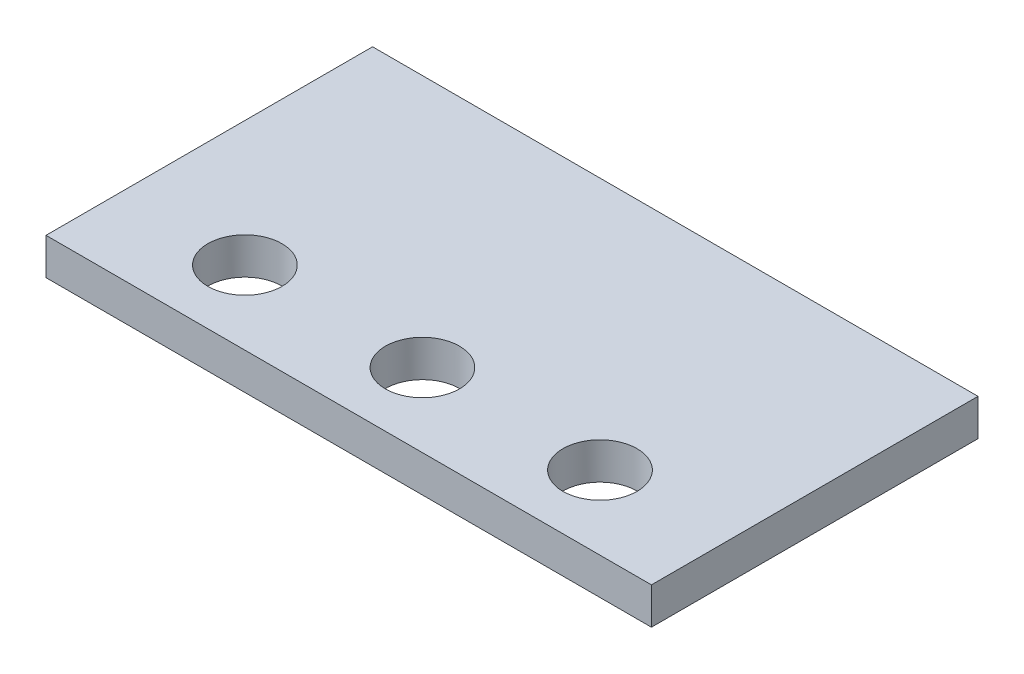
ISO-10303-21;
HEADER;
FILE_DESCRIPTION(('STEP AP214'),'2;1');
FILE_NAME('part.step','',(''),(''),'','','');
FILE_SCHEMA(('AUTOMOTIVE_DESIGN { 1 0 10303 214 1 1 1 1 }'));
ENDSEC;
DATA;
#1=APPLICATION_CONTEXT('core data for automotive mechanical design processes');
#2=APPLICATION_PROTOCOL_DEFINITION('international standard','automotive_design',2000,#1);
#3=PRODUCT_CONTEXT('',#1,'mechanical');
#4=PRODUCT('Part','Part','',(#3));
#5=PRODUCT_RELATED_PRODUCT_CATEGORY('part','',(#4));
#6=PRODUCT_DEFINITION_FORMATION('','',#4);
#7=PRODUCT_DEFINITION_CONTEXT('part definition',#1,'design');
#8=PRODUCT_DEFINITION('design','',#6,#7);
#9=PRODUCT_DEFINITION_SHAPE('','',#8);
#10=(LENGTH_UNIT() NAMED_UNIT(*) SI_UNIT(.MILLI.,.METRE.));
#11=(NAMED_UNIT(*) PLANE_ANGLE_UNIT() SI_UNIT($,.RADIAN.));
#12=(NAMED_UNIT(*) SI_UNIT($,.STERADIAN.) SOLID_ANGLE_UNIT());
#13=UNCERTAINTY_MEASURE_WITH_UNIT(LENGTH_MEASURE(1.E-05),#10,'distance_accuracy_value','');
#14=(GEOMETRIC_REPRESENTATION_CONTEXT(3) GLOBAL_UNCERTAINTY_ASSIGNED_CONTEXT((#13)) GLOBAL_UNIT_ASSIGNED_CONTEXT((#10,
#11,#12)) REPRESENTATION_CONTEXT('',''));
#15=CARTESIAN_POINT('',(0.,0.,0.));
#16=DIRECTION('',(0.,0.,1.));
#17=DIRECTION('',(1.,0.,0.));
#18=AXIS2_PLACEMENT_3D('',#15,#16,#17);
#19=CARTESIAN_POINT('',(0.,-167.165586138057,182.));
#20=DIRECTION('',(0.,1.,0.));
#21=DIRECTION('',(-1.,0.,0.));
#22=AXIS2_PLACEMENT_3D('',#19,#20,#21);
#23=PLANE('',#22);
#24=CARTESIAN_POINT('',(89.0112686576685,-167.165586138057,319.809692798291));
#25=DIRECTION('',(0.,-1.,0.));
#26=DIRECTION('',(1.,0.,0.));
#27=AXIS2_PLACEMENT_3D('',#24,#25,#26);
#28=CIRCLE('',#27,20.1903072017096);
#29=CARTESIAN_POINT('',(109.201575859378,-167.165586138057,319.809692798291));
#30=VERTEX_POINT('',#29);
#31=EDGE_CURVE('E100',#30,#30,#28,.T.);
#32=ORIENTED_EDGE('',*,*,#31,.F.);
#33=EDGE_LOOP('',(#32));
#34=FACE_BOUND('',#33,.T.);
#35=CARTESIAN_POINT('',(-7.75409298345245,-167.165586138057,319.809692798291));
#36=DIRECTION('',(0.,-1.,0.));
#37=DIRECTION('',(1.,0.,0.));
#38=AXIS2_PLACEMENT_3D('',#35,#36,#37);
#39=CIRCLE('',#38,20.1903072017096);
#40=CARTESIAN_POINT('',(12.4362142182571,-167.165586138057,319.809692798291));
#41=VERTEX_POINT('',#40);
#42=EDGE_CURVE('E116',#41,#41,#39,.T.);
#43=ORIENTED_EDGE('',*,*,#42,.F.);
#44=EDGE_LOOP('',(#43));
#45=FACE_BOUND('',#44,.T.);
#46=CARTESIAN_POINT('',(-104.519454624573,-167.165586138056,319.809692798291));
#47=DIRECTION('',(0.,-1.,0.));
#48=DIRECTION('',(1.,0.,0.));
#49=AXIS2_PLACEMENT_3D('',#46,#47,#48);
#50=CIRCLE('',#49,20.1903072017096);
#51=CARTESIAN_POINT('',(-84.3291474228638,-167.165586138056,319.809692798291));
#52=VERTEX_POINT('',#51);
#53=EDGE_CURVE('E110',#52,#52,#50,.T.);
#54=ORIENTED_EDGE('',*,*,#53,.F.);
#55=EDGE_LOOP('',(#54));
#56=FACE_BOUND('',#55,.T.);
#57=DIRECTION('',(-1.,0.,0.));
#58=VECTOR('',#57,1.);
#59=CARTESIAN_POINT('',(0.,-167.165586138057,360.));
#60=LINE('',#59,#58);
#61=CARTESIAN_POINT('',(157.245907016548,-167.165586138057,360.));
#62=VERTEX_POINT('',#61);
#63=CARTESIAN_POINT('',(-172.754092983452,-167.165586138056,360.));
#64=VERTEX_POINT('',#63);
#65=EDGE_CURVE('E98',#62,#64,#60,.T.);
#66=ORIENTED_EDGE('',*,*,#65,.T.);
#67=DIRECTION('',(0.,0.,1.));
#68=VECTOR('',#67,1.);
#69=CARTESIAN_POINT('',(-172.754092983452,-167.165586138056,182.));
#70=LINE('',#69,#68);
#71=CARTESIAN_POINT('',(-172.754092983452,-167.165586138056,182.));
#72=VERTEX_POINT('',#71);
#73=EDGE_CURVE('E11',#72,#64,#70,.T.);
#74=ORIENTED_EDGE('',*,*,#73,.F.);
#75=DIRECTION('',(-1.,0.,0.));
#76=VECTOR('',#75,1.);
#77=CARTESIAN_POINT('',(0.,-167.165586138057,182.));
#78=LINE('',#77,#76);
#79=CARTESIAN_POINT('',(157.245907016548,-167.165586138057,182.));
#80=VERTEX_POINT('',#79);
#81=EDGE_CURVE('E84',#80,#72,#78,.T.);
#82=ORIENTED_EDGE('',*,*,#81,.F.);
#83=DIRECTION('',(0.,0.,1.));
#84=VECTOR('',#83,1.);
#85=CARTESIAN_POINT('',(157.245907016548,-167.165586138057,182.));
#86=LINE('',#85,#84);
#87=EDGE_CURVE('E51',#80,#62,#86,.T.);
#88=ORIENTED_EDGE('',*,*,#87,.T.);
#89=EDGE_LOOP('',(#66,#74,#82,#88));
#90=FACE_BOUND('',#89,.T.);
#91=ADVANCED_FACE('F35',(#34,#45,#56,#90),#23,.F.);
#92=CARTESIAN_POINT('',(-172.754092983452,0.,182.));
#93=DIRECTION('',(1.,0.,0.));
#94=DIRECTION('',(0.,0.,-1.));
#95=AXIS2_PLACEMENT_3D('',#92,#93,#94);
#96=PLANE('',#95);
#97=DIRECTION('',(0.,1.,0.));
#98=VECTOR('',#97,1.);
#99=CARTESIAN_POINT('',(-172.754092983452,0.,360.));
#100=LINE('',#99,#98);
#101=CARTESIAN_POINT('',(-172.754092983452,-147.165586138057,360.));
#102=VERTEX_POINT('',#101);
#103=EDGE_CURVE('E89',#64,#102,#100,.T.);
#104=ORIENTED_EDGE('',*,*,#103,.T.);
#105=DIRECTION('',(0.,0.,1.));
#106=VECTOR('',#105,1.);
#107=CARTESIAN_POINT('',(-172.754092983452,-147.165586138057,182.));
#108=LINE('',#107,#106);
#109=CARTESIAN_POINT('',(-172.754092983452,-147.165586138057,182.));
#110=VERTEX_POINT('',#109);
#111=EDGE_CURVE('E43',#110,#102,#108,.T.);
#112=ORIENTED_EDGE('',*,*,#111,.F.);
#113=DIRECTION('',(0.,1.,0.));
#114=VECTOR('',#113,1.);
#115=CARTESIAN_POINT('',(-172.754092983452,0.,182.));
#116=LINE('',#115,#114);
#117=EDGE_CURVE('E76',#72,#110,#116,.T.);
#118=ORIENTED_EDGE('',*,*,#117,.F.);
#119=ORIENTED_EDGE('',*,*,#73,.T.);
#120=EDGE_LOOP('',(#104,#112,#118,#119));
#121=FACE_BOUND('',#120,.T.);
#122=ADVANCED_FACE('F88',(#121),#96,.F.);
#123=CARTESIAN_POINT('',(0.,-147.165586138057,182.));
#124=DIRECTION('',(0.,1.,0.));
#125=DIRECTION('',(-1.,0.,0.));
#126=AXIS2_PLACEMENT_3D('',#123,#124,#125);
#127=PLANE('',#126);
#128=CARTESIAN_POINT('',(89.0112686576685,-147.165586138057,319.809692798291));
#129=DIRECTION('',(0.,1.,0.));
#130=DIRECTION('',(-1.,0.,0.));
#131=AXIS2_PLACEMENT_3D('',#128,#129,#130);
#132=CIRCLE('',#131,20.1903072017096);
#133=CARTESIAN_POINT('',(68.8209614559589,-147.165586138057,319.809692798291));
#134=VERTEX_POINT('',#133);
#135=EDGE_CURVE('E122',#134,#134,#132,.F.);
#136=ORIENTED_EDGE('',*,*,#135,.T.);
#137=EDGE_LOOP('',(#136));
#138=FACE_BOUND('',#137,.T.);
#139=CARTESIAN_POINT('',(-7.75409298345244,-147.165586138057,319.809692798291));
#140=DIRECTION('',(0.,1.,0.));
#141=DIRECTION('',(-1.,0.,0.));
#142=AXIS2_PLACEMENT_3D('',#139,#140,#141);
#143=CIRCLE('',#142,20.1903072017096);
#144=CARTESIAN_POINT('',(-27.944400185162,-147.165586138057,319.809692798291));
#145=VERTEX_POINT('',#144);
#146=EDGE_CURVE('E119',#145,#145,#143,.F.);
#147=ORIENTED_EDGE('',*,*,#146,.T.);
#148=EDGE_LOOP('',(#147));
#149=FACE_BOUND('',#148,.T.);
#150=CARTESIAN_POINT('',(-104.519454624573,-147.165586138057,319.809692798291));
#151=DIRECTION('',(0.,1.,0.));
#152=DIRECTION('',(-1.,0.,0.));
#153=AXIS2_PLACEMENT_3D('',#150,#151,#152);
#154=CIRCLE('',#153,20.1903072017096);
#155=CARTESIAN_POINT('',(-124.709761826283,-147.165586138057,319.809692798291));
#156=VERTEX_POINT('',#155);
#157=EDGE_CURVE('E113',#156,#156,#154,.F.);
#158=ORIENTED_EDGE('',*,*,#157,.T.);
#159=EDGE_LOOP('',(#158));
#160=FACE_BOUND('',#159,.T.);
#161=DIRECTION('',(-1.,0.,0.));
#162=VECTOR('',#161,1.);
#163=CARTESIAN_POINT('',(0.,-147.165586138057,360.));
#164=LINE('',#163,#162);
#165=CARTESIAN_POINT('',(157.245907016548,-147.165586138057,360.));
#166=VERTEX_POINT('',#165);
#167=EDGE_CURVE('E102',#166,#102,#164,.T.);
#168=ORIENTED_EDGE('',*,*,#167,.F.);
#169=DIRECTION('',(0.,0.,1.));
#170=VECTOR('',#169,1.);
#171=CARTESIAN_POINT('',(157.245907016548,-147.165586138057,182.));
#172=LINE('',#171,#170);
#173=CARTESIAN_POINT('',(157.245907016548,-147.165586138057,182.));
#174=VERTEX_POINT('',#173);
#175=EDGE_CURVE('E65',#174,#166,#172,.T.);
#176=ORIENTED_EDGE('',*,*,#175,.F.);
#177=DIRECTION('',(-1.,0.,0.));
#178=VECTOR('',#177,1.);
#179=CARTESIAN_POINT('',(0.,-147.165586138057,182.));
#180=LINE('',#179,#178);
#181=EDGE_CURVE('E83',#174,#110,#180,.T.);
#182=ORIENTED_EDGE('',*,*,#181,.T.);
#183=ORIENTED_EDGE('',*,*,#111,.T.);
#184=EDGE_LOOP('',(#168,#176,#182,#183));
#185=FACE_BOUND('',#184,.T.);
#186=ADVANCED_FACE('F92',(#138,#149,#160,#185),#127,.T.);
#187=CARTESIAN_POINT('',(157.245907016548,0.,182.));
#188=DIRECTION('',(1.,0.,0.));
#189=DIRECTION('',(0.,0.,-1.));
#190=AXIS2_PLACEMENT_3D('',#187,#188,#189);
#191=PLANE('',#190);
#192=DIRECTION('',(0.,1.,0.));
#193=VECTOR('',#192,1.);
#194=CARTESIAN_POINT('',(157.245907016548,0.,360.));
#195=LINE('',#194,#193);
#196=EDGE_CURVE('E104',#62,#166,#195,.T.);
#197=ORIENTED_EDGE('',*,*,#196,.F.);
#198=ORIENTED_EDGE('',*,*,#87,.F.);
#199=DIRECTION('',(0.,1.,0.));
#200=VECTOR('',#199,1.);
#201=CARTESIAN_POINT('',(157.245907016548,0.,182.));
#202=LINE('',#201,#200);
#203=EDGE_CURVE('E93',#80,#174,#202,.T.);
#204=ORIENTED_EDGE('',*,*,#203,.T.);
#205=ORIENTED_EDGE('',*,*,#175,.T.);
#206=EDGE_LOOP('',(#197,#198,#204,#205));
#207=FACE_BOUND('',#206,.T.);
#208=ADVANCED_FACE('F136',(#207),#191,.T.);
#209=CARTESIAN_POINT('',(0.,0.,182.));
#210=DIRECTION('',(0.,0.,-1.));
#211=DIRECTION('',(-1.,0.,0.));
#212=AXIS2_PLACEMENT_3D('',#209,#210,#211);
#213=PLANE('',#212);
#214=ORIENTED_EDGE('',*,*,#81,.T.);
#215=ORIENTED_EDGE('',*,*,#117,.T.);
#216=ORIENTED_EDGE('',*,*,#181,.F.);
#217=ORIENTED_EDGE('',*,*,#203,.F.);
#218=EDGE_LOOP('',(#214,#215,#216,#217));
#219=FACE_BOUND('',#218,.T.);
#220=ADVANCED_FACE('F80',(#219),#213,.T.);
#221=CARTESIAN_POINT('',(0.,0.,360.));
#222=DIRECTION('',(0.,0.,-1.));
#223=DIRECTION('',(-1.,0.,0.));
#224=AXIS2_PLACEMENT_3D('',#221,#222,#223);
#225=PLANE('',#224);
#226=ORIENTED_EDGE('',*,*,#65,.F.);
#227=ORIENTED_EDGE('',*,*,#196,.T.);
#228=ORIENTED_EDGE('',*,*,#167,.T.);
#229=ORIENTED_EDGE('',*,*,#103,.F.);
#230=EDGE_LOOP('',(#226,#227,#228,#229));
#231=FACE_BOUND('',#230,.T.);
#232=ADVANCED_FACE('F135',(#231),#225,.F.);
#233=CARTESIAN_POINT('',(-104.519454624573,-147.164586138056,319.809692798291));
#234=DIRECTION('',(0.,-1.,0.));
#235=DIRECTION('',(1.,0.,0.));
#236=AXIS2_PLACEMENT_3D('',#233,#234,#235);
#237=CYLINDRICAL_SURFACE('',#236,20.1903072017096);
#238=ORIENTED_EDGE('',*,*,#157,.F.);
#239=EDGE_LOOP('',(#238));
#240=FACE_BOUND('',#239,.T.);
#241=ORIENTED_EDGE('',*,*,#53,.T.);
#242=EDGE_LOOP('',(#241));
#243=FACE_BOUND('',#242,.T.);
#244=ADVANCED_FACE('F165',(#240,#243),#237,.F.);
#245=CARTESIAN_POINT('',(-7.75409298345244,-147.164586138056,319.809692798291));
#246=DIRECTION('',(0.,-1.,0.));
#247=DIRECTION('',(1.,0.,0.));
#248=AXIS2_PLACEMENT_3D('',#245,#246,#247);
#249=CYLINDRICAL_SURFACE('',#248,20.1903072017096);
#250=ORIENTED_EDGE('',*,*,#146,.F.);
#251=EDGE_LOOP('',(#250));
#252=FACE_BOUND('',#251,.T.);
#253=ORIENTED_EDGE('',*,*,#42,.T.);
#254=EDGE_LOOP('',(#253));
#255=FACE_BOUND('',#254,.T.);
#256=ADVANCED_FACE('F170',(#252,#255),#249,.F.);
#257=CARTESIAN_POINT('',(89.0112686576685,-147.164586138057,319.809692798291));
#258=DIRECTION('',(0.,-1.,0.));
#259=DIRECTION('',(1.,0.,0.));
#260=AXIS2_PLACEMENT_3D('',#257,#258,#259);
#261=CYLINDRICAL_SURFACE('',#260,20.1903072017096);
#262=ORIENTED_EDGE('',*,*,#135,.F.);
#263=EDGE_LOOP('',(#262));
#264=FACE_BOUND('',#263,.T.);
#265=ORIENTED_EDGE('',*,*,#31,.T.);
#266=EDGE_LOOP('',(#265));
#267=FACE_BOUND('',#266,.T.);
#268=ADVANCED_FACE('F128',(#264,#267),#261,.F.);
#269=CLOSED_SHELL('',(#91,#122,#186,#208,#220,#232,#244,#256,#268));
#270=MANIFOLD_SOLID_BREP('B2',#269);
#271=ADVANCED_BREP_SHAPE_REPRESENTATION('',(#18,#270),#14);
#272=SHAPE_DEFINITION_REPRESENTATION(#9,#271);
ENDSEC;
END-ISO-10303-21;
